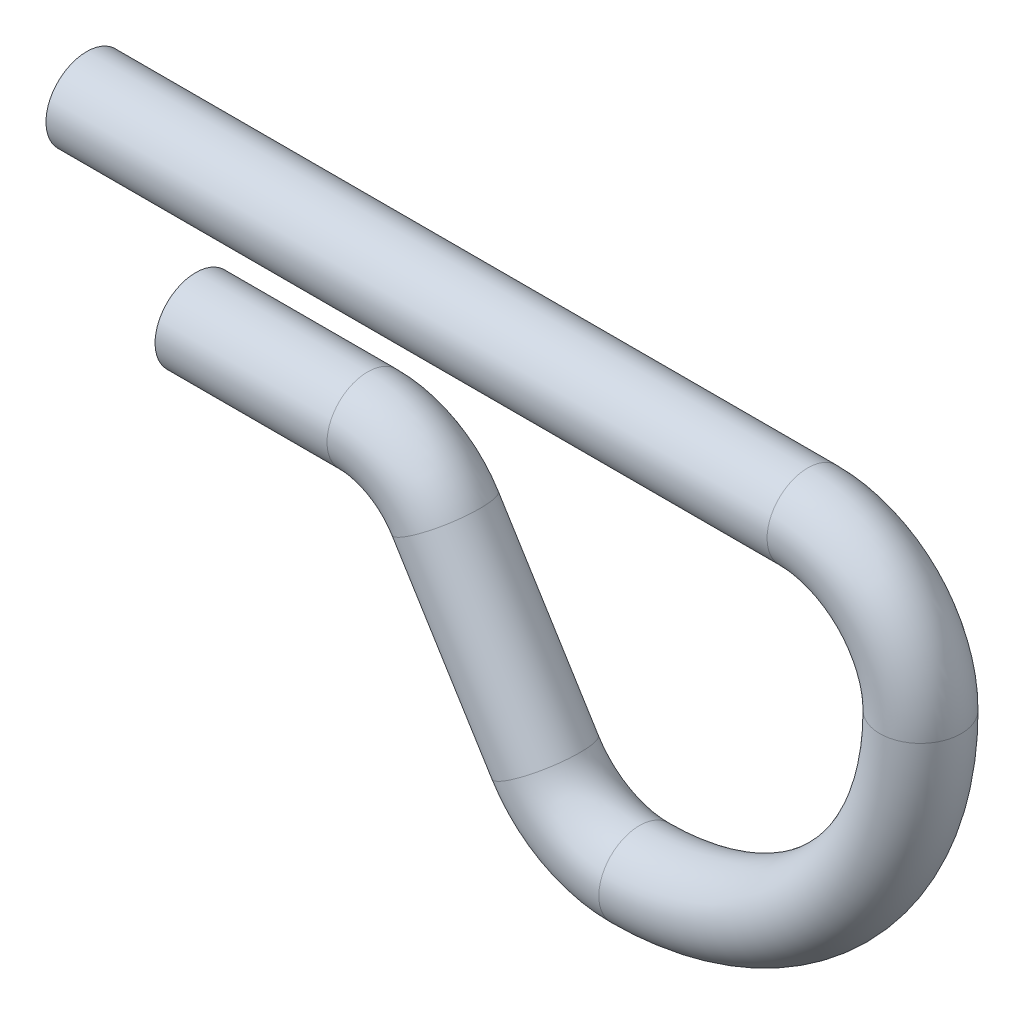
ISO-10303-21;
HEADER;
FILE_DESCRIPTION(('STEP AP214'),'2;1');
FILE_NAME('part.step','',(''),(''),'','','');
FILE_SCHEMA(('AUTOMOTIVE_DESIGN { 1 0 10303 214 1 1 1 1 }'));
ENDSEC;
DATA;
#1=APPLICATION_CONTEXT('core data for automotive mechanical design processes');
#2=APPLICATION_PROTOCOL_DEFINITION('international standard','automotive_design',2000,#1);
#3=PRODUCT_CONTEXT('',#1,'mechanical');
#4=PRODUCT('Part','Part','',(#3));
#5=PRODUCT_RELATED_PRODUCT_CATEGORY('part','',(#4));
#6=PRODUCT_DEFINITION_FORMATION('','',#4);
#7=PRODUCT_DEFINITION_CONTEXT('part definition',#1,'design');
#8=PRODUCT_DEFINITION('design','',#6,#7);
#9=PRODUCT_DEFINITION_SHAPE('','',#8);
#10=(LENGTH_UNIT() NAMED_UNIT(*) SI_UNIT(.MILLI.,.METRE.));
#11=(NAMED_UNIT(*) PLANE_ANGLE_UNIT() SI_UNIT($,.RADIAN.));
#12=(NAMED_UNIT(*) SI_UNIT($,.STERADIAN.) SOLID_ANGLE_UNIT());
#13=UNCERTAINTY_MEASURE_WITH_UNIT(LENGTH_MEASURE(1.E-05),#10,'distance_accuracy_value','');
#14=(GEOMETRIC_REPRESENTATION_CONTEXT(3) GLOBAL_UNCERTAINTY_ASSIGNED_CONTEXT((#13)) GLOBAL_UNIT_ASSIGNED_CONTEXT((#10,
#11,#12)) REPRESENTATION_CONTEXT('',''));
#15=CARTESIAN_POINT('',(0.,0.,0.));
#16=DIRECTION('',(0.,0.,1.));
#17=DIRECTION('',(1.,0.,0.));
#18=AXIS2_PLACEMENT_3D('',#15,#16,#17);
#19=CARTESIAN_POINT('',(0.,0.,0.));
#20=DIRECTION('',(-1.,0.,0.));
#21=DIRECTION('',(0.,0.,-1.));
#22=AXIS2_PLACEMENT_3D('',#19,#20,#21);
#23=PLANE('',#22);
#24=CARTESIAN_POINT('',(0.,0.,0.));
#25=DIRECTION('',(-1.,0.,0.));
#26=DIRECTION('',(0.,0.,-1.));
#27=AXIS2_PLACEMENT_3D('',#24,#25,#26);
#28=CIRCLE('',#27,5.588);
#29=CARTESIAN_POINT('',(0.,0.,-5.588));
#30=VERTEX_POINT('',#29);
#31=EDGE_CURVE('E79',#30,#30,#28,.T.);
#32=ORIENTED_EDGE('',*,*,#31,.T.);
#33=EDGE_LOOP('',(#32));
#34=FACE_BOUND('',#33,.T.);
#35=ADVANCED_FACE('F51',(#34),#23,.T.);
#36=CARTESIAN_POINT('',(-14.986,18.796,0.));
#37=DIRECTION('',(1.,0.,0.));
#38=DIRECTION('',(0.,0.,-1.));
#39=AXIS2_PLACEMENT_3D('',#36,#37,#38);
#40=PLANE('',#39);
#41=CARTESIAN_POINT('',(-14.986,18.796,0.));
#42=DIRECTION('',(1.,0.,0.));
#43=DIRECTION('',(0.,0.,-1.));
#44=AXIS2_PLACEMENT_3D('',#41,#42,#43);
#45=CIRCLE('',#44,5.588);
#46=CARTESIAN_POINT('',(-14.986,18.796,-5.588));
#47=VERTEX_POINT('',#46);
#48=EDGE_CURVE('E11',#47,#47,#45,.T.);
#49=ORIENTED_EDGE('',*,*,#48,.F.);
#50=EDGE_LOOP('',(#49));
#51=FACE_BOUND('',#50,.T.);
#52=ADVANCED_FACE('F87',(#51),#40,.F.);
#53=CARTESIAN_POINT('',(0.,0.,0.));
#54=DIRECTION('',(1.,0.,0.));
#55=DIRECTION('',(0.,1.,0.));
#56=AXIS2_PLACEMENT_3D('',#53,#54,#55);
#57=CYLINDRICAL_SURFACE('',#56,5.588);
#58=CARTESIAN_POINT('',(23.622,0.,0.));
#59=DIRECTION('',(-1.,0.,0.));
#60=DIRECTION('',(0.,0.,-1.));
#61=AXIS2_PLACEMENT_3D('',#58,#59,#60);
#62=CIRCLE('',#61,5.588);
#63=CARTESIAN_POINT('',(23.622,5.588,0.));
#64=VERTEX_POINT('',#63);
#65=EDGE_CURVE('E76',#64,#64,#62,.T.);
#66=ORIENTED_EDGE('',*,*,#65,.T.);
#67=EDGE_LOOP('',(#66));
#68=FACE_BOUND('',#67,.T.);
#69=ORIENTED_EDGE('',*,*,#31,.F.);
#70=EDGE_LOOP('',(#69));
#71=FACE_BOUND('',#70,.T.);
#72=ADVANCED_FACE('F84',(#68,#71),#57,.T.);
#73=CARTESIAN_POINT('',(23.622,-12.5246444603595,0.));
#74=DIRECTION('',(0.,0.,-1.));
#75=DIRECTION('',(-1.,0.,0.));
#76=AXIS2_PLACEMENT_3D('',#73,#74,#75);
#77=TOROIDAL_SURFACE('',#76,12.5246444603595,5.588);
#78=CARTESIAN_POINT('',(34.2679477913056,-5.92687858976284,0.));
#79=DIRECTION('',(-0.526782687642637,0.85,0.));
#80=DIRECTION('',(0.,0.,-1.));
#81=AXIS2_PLACEMENT_3D('',#78,#79,#80);
#82=CIRCLE('',#81,5.588);
#83=CARTESIAN_POINT('',(39.0177477913056,-2.98321693121579,0.));
#84=VERTEX_POINT('',#83);
#85=EDGE_CURVE('E73',#84,#84,#82,.T.);
#86=CARTESIAN_POINT('',(23.622,-12.5246444603595,0.));
#87=DIRECTION('',(0.,0.,-1.));
#88=DIRECTION('',(-1.,0.,0.));
#89=AXIS2_PLACEMENT_3D('',#86,#87,#88);
#90=CIRCLE('',#89,18.1126444603595);
#91=EDGE_CURVE('',#64,#84,#90,.T.);
#92=ORIENTED_EDGE('',*,*,#65,.F.);
#93=ORIENTED_EDGE('',*,*,#85,.T.);
#94=ORIENTED_EDGE('',*,*,#91,.T.);
#95=ORIENTED_EDGE('',*,*,#91,.F.);
#96=EDGE_LOOP('',(#92,#94,#93,#95));
#97=FACE_BOUND('',#96,.T.);
#98=ADVANCED_FACE('F86',(#97),#77,.T.);
#99=CARTESIAN_POINT('',(34.2679477913056,-5.92687858976284,0.));
#100=DIRECTION('',(0.526782687642637,-0.85,0.));
#101=DIRECTION('',(0.85,0.526782687642637,0.));
#102=AXIS2_PLACEMENT_3D('',#99,#100,#101);
#103=CYLINDRICAL_SURFACE('',#102,5.588);
#104=CARTESIAN_POINT('',(48.006,-28.0941681596738,0.));
#105=DIRECTION('',(-0.526782687642637,0.85,0.));
#106=DIRECTION('',(0.,0.,-1.));
#107=AXIS2_PLACEMENT_3D('',#104,#105,#106);
#108=CIRCLE('',#107,5.588);
#109=CARTESIAN_POINT('',(43.2562,-31.0378298182208,0.));
#110=VERTEX_POINT('',#109);
#111=EDGE_CURVE('E70',#110,#110,#108,.T.);
#112=ORIENTED_EDGE('',*,*,#111,.T.);
#113=EDGE_LOOP('',(#112));
#114=FACE_BOUND('',#113,.T.);
#115=ORIENTED_EDGE('',*,*,#85,.F.);
#116=EDGE_LOOP('',(#115));
#117=FACE_BOUND('',#116,.T.);
#118=ADVANCED_FACE('F94',(#114,#117),#103,.T.);
#119=CARTESIAN_POINT('',(60.96,-20.066,0.));
#120=DIRECTION('',(0.,0.,1.));
#121=DIRECTION('',(1.,0.,0.));
#122=AXIS2_PLACEMENT_3D('',#119,#120,#121);
#123=TOROIDAL_SURFACE('',#122,15.24,5.588);
#124=CARTESIAN_POINT('',(60.96,-35.306,0.));
#125=DIRECTION('',(-1.,0.,0.));
#126=DIRECTION('',(0.,0.,-1.));
#127=AXIS2_PLACEMENT_3D('',#124,#125,#126);
#128=CIRCLE('',#127,5.588);
#129=CARTESIAN_POINT('',(60.96,-40.894,0.));
#130=VERTEX_POINT('',#129);
#131=EDGE_CURVE('E65',#130,#130,#128,.T.);
#132=CARTESIAN_POINT('',(60.96,-20.066,0.));
#133=DIRECTION('',(0.,0.,1.));
#134=DIRECTION('',(1.,0.,0.));
#135=AXIS2_PLACEMENT_3D('',#132,#133,#134);
#136=CIRCLE('',#135,20.828);
#137=EDGE_CURVE('',#110,#130,#136,.T.);
#138=ORIENTED_EDGE('',*,*,#111,.F.);
#139=ORIENTED_EDGE('',*,*,#131,.T.);
#140=ORIENTED_EDGE('',*,*,#137,.T.);
#141=ORIENTED_EDGE('',*,*,#137,.F.);
#142=EDGE_LOOP('',(#138,#140,#139,#141));
#143=FACE_BOUND('',#142,.T.);
#144=ADVANCED_FACE('F111',(#143),#123,.T.);
#145=CARTESIAN_POINT('',(60.96,3.30200000000001,0.));
#146=DIRECTION('',(0.,0.,1.));
#147=DIRECTION('',(1.,0.,0.));
#148=AXIS2_PLACEMENT_3D('',#145,#146,#147);
#149=TOROIDAL_SURFACE('',#148,38.608,5.588);
#150=CARTESIAN_POINT('',(99.568,3.30200000000001,0.));
#151=DIRECTION('',(0.,-1.,0.));
#152=DIRECTION('',(0.,0.,-1.));
#153=AXIS2_PLACEMENT_3D('',#150,#151,#152);
#154=CIRCLE('',#153,5.588);
#155=CARTESIAN_POINT('',(105.156,3.30200000000001,0.));
#156=VERTEX_POINT('',#155);
#157=EDGE_CURVE('E61',#156,#156,#154,.T.);
#158=CARTESIAN_POINT('',(60.96,3.30200000000001,0.));
#159=DIRECTION('',(0.,0.,1.));
#160=DIRECTION('',(1.,0.,0.));
#161=AXIS2_PLACEMENT_3D('',#158,#159,#160);
#162=CIRCLE('',#161,44.196);
#163=EDGE_CURVE('',#130,#156,#162,.T.);
#164=ORIENTED_EDGE('',*,*,#131,.F.);
#165=ORIENTED_EDGE('',*,*,#157,.T.);
#166=ORIENTED_EDGE('',*,*,#163,.T.);
#167=ORIENTED_EDGE('',*,*,#163,.F.);
#168=EDGE_LOOP('',(#164,#166,#165,#167));
#169=FACE_BOUND('',#168,.T.);
#170=ADVANCED_FACE('F105',(#169),#149,.T.);
#171=CARTESIAN_POINT('',(84.074,3.302,0.));
#172=DIRECTION('',(0.,0.,1.));
#173=DIRECTION('',(1.,0.,0.));
#174=AXIS2_PLACEMENT_3D('',#171,#172,#173);
#175=TOROIDAL_SURFACE('',#174,15.494,5.588);
#176=CARTESIAN_POINT('',(84.074,18.796,0.));
#177=DIRECTION('',(1.,0.,0.));
#178=DIRECTION('',(0.,0.,-1.));
#179=AXIS2_PLACEMENT_3D('',#176,#177,#178);
#180=CIRCLE('',#179,5.588);
#181=CARTESIAN_POINT('',(84.074,24.384,0.));
#182=VERTEX_POINT('',#181);
#183=EDGE_CURVE('E57',#182,#182,#180,.T.);
#184=CARTESIAN_POINT('',(84.074,3.302,0.));
#185=DIRECTION('',(0.,0.,1.));
#186=DIRECTION('',(1.,0.,0.));
#187=AXIS2_PLACEMENT_3D('',#184,#185,#186);
#188=CIRCLE('',#187,21.082);
#189=EDGE_CURVE('',#156,#182,#188,.T.);
#190=ORIENTED_EDGE('',*,*,#157,.F.);
#191=ORIENTED_EDGE('',*,*,#183,.T.);
#192=ORIENTED_EDGE('',*,*,#189,.T.);
#193=ORIENTED_EDGE('',*,*,#189,.F.);
#194=EDGE_LOOP('',(#190,#192,#191,#193));
#195=FACE_BOUND('',#194,.T.);
#196=ADVANCED_FACE('F100',(#195),#175,.T.);
#197=CARTESIAN_POINT('',(84.074,18.796,0.));
#198=DIRECTION('',(-1.,0.,0.));
#199=DIRECTION('',(0.,0.,1.));
#200=AXIS2_PLACEMENT_3D('',#197,#198,#199);
#201=CYLINDRICAL_SURFACE('',#200,5.588);
#202=ORIENTED_EDGE('',*,*,#48,.T.);
#203=EDGE_LOOP('',(#202));
#204=FACE_BOUND('',#203,.T.);
#205=ORIENTED_EDGE('',*,*,#183,.F.);
#206=EDGE_LOOP('',(#205));
#207=FACE_BOUND('',#206,.T.);
#208=ADVANCED_FACE('F98',(#204,#207),#201,.T.);
#209=CLOSED_SHELL('',(#35,#52,#72,#98,#118,#144,#170,#196,#208));
#210=MANIFOLD_SOLID_BREP('B2',#209);
#211=ADVANCED_BREP_SHAPE_REPRESENTATION('',(#18,#210),#14);
#212=SHAPE_DEFINITION_REPRESENTATION(#9,#211);
ENDSEC;
END-ISO-10303-21;
